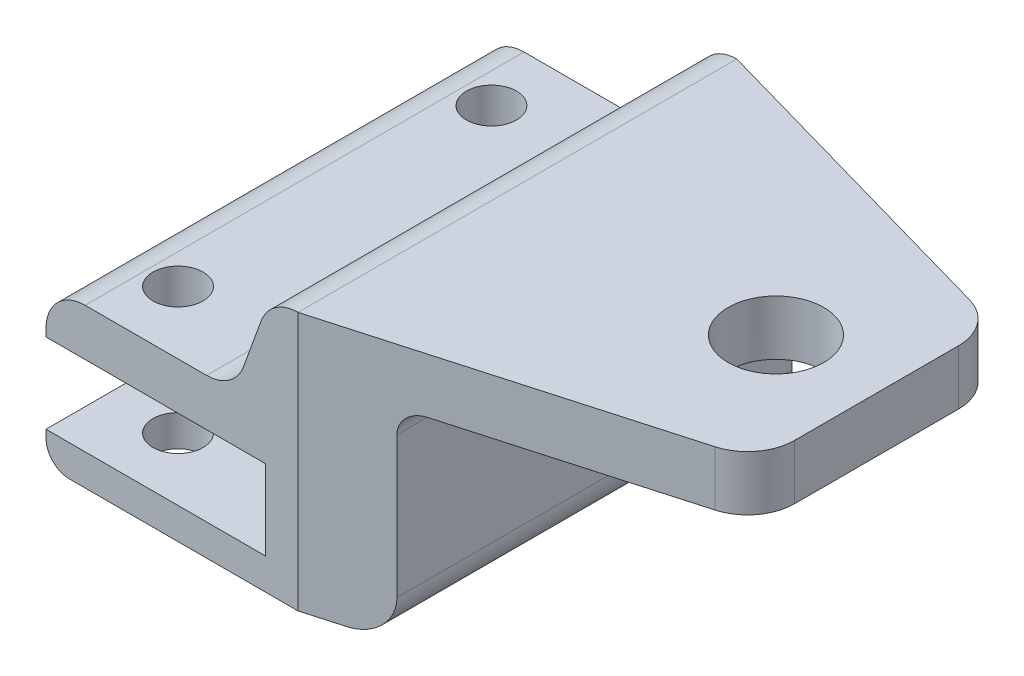
ISO-10303-21;
HEADER;
FILE_DESCRIPTION(('STEP AP214'),'2;1');
FILE_NAME('part.step','',(''),(''),'','','');
FILE_SCHEMA(('AUTOMOTIVE_DESIGN { 1 0 10303 214 1 1 1 1 }'));
ENDSEC;
DATA;
#1=APPLICATION_CONTEXT('core data for automotive mechanical design processes');
#2=APPLICATION_PROTOCOL_DEFINITION('international standard','automotive_design',2000,#1);
#3=PRODUCT_CONTEXT('',#1,'mechanical');
#4=PRODUCT('Part','Part','',(#3));
#5=PRODUCT_RELATED_PRODUCT_CATEGORY('part','',(#4));
#6=PRODUCT_DEFINITION_FORMATION('','',#4);
#7=PRODUCT_DEFINITION_CONTEXT('part definition',#1,'design');
#8=PRODUCT_DEFINITION('design','',#6,#7);
#9=PRODUCT_DEFINITION_SHAPE('','',#8);
#10=(LENGTH_UNIT() NAMED_UNIT(*) SI_UNIT(.MILLI.,.METRE.));
#11=(NAMED_UNIT(*) PLANE_ANGLE_UNIT() SI_UNIT($,.RADIAN.));
#12=(NAMED_UNIT(*) SI_UNIT($,.STERADIAN.) SOLID_ANGLE_UNIT());
#13=UNCERTAINTY_MEASURE_WITH_UNIT(LENGTH_MEASURE(1.E-05),#10,'distance_accuracy_value','');
#14=(GEOMETRIC_REPRESENTATION_CONTEXT(3) GLOBAL_UNCERTAINTY_ASSIGNED_CONTEXT((#13)) GLOBAL_UNIT_ASSIGNED_CONTEXT((#10,
#11,#12)) REPRESENTATION_CONTEXT('',''));
#15=CARTESIAN_POINT('',(0.,0.,0.));
#16=DIRECTION('',(0.,0.,1.));
#17=DIRECTION('',(1.,0.,0.));
#18=AXIS2_PLACEMENT_3D('',#15,#16,#17);
#19=CARTESIAN_POINT('',(18.5,2.5,28.));
#20=DIRECTION('',(0.,0.,-1.));
#21=DIRECTION('',(-1.,0.,0.));
#22=AXIS2_PLACEMENT_3D('',#19,#20,#21);
#23=CYLINDRICAL_SURFACE('',#22,2.5);
#24=DIRECTION('',(0.,0.,-1.));
#25=VECTOR('',#24,1.);
#26=CARTESIAN_POINT('',(21.,2.5,28.));
#27=LINE('',#26,#25);
#28=CARTESIAN_POINT('',(21.,2.5,26.6046960829897));
#29=VERTEX_POINT('',#28);
#30=CARTESIAN_POINT('',(21.,2.5,1.3953039170103));
#31=VERTEX_POINT('',#30);
#32=EDGE_CURVE('E11',#29,#31,#27,.T.);
#33=ORIENTED_EDGE('',*,*,#32,.F.);
#34=CARTESIAN_POINT('',(18.5,2.5,27.3136816500716));
#35=DIRECTION('',(-0.272834907920826,0.,-0.962060867627321));
#36=DIRECTION('',(0.962060867627321,0.,-0.272834907920826));
#37=AXIS2_PLACEMENT_3D('',#34,#35,#36);
#38=ELLIPSE('',#37,2.59858818098029,2.5);
#39=CARTESIAN_POINT('',(18.5,0.,27.3136816500716));
#40=VERTEX_POINT('',#39);
#41=EDGE_CURVE('E290',#29,#40,#38,.T.);
#42=ORIENTED_EDGE('',*,*,#41,.T.);
#43=DIRECTION('',(0.,0.,-1.));
#44=VECTOR('',#43,1.);
#45=CARTESIAN_POINT('',(18.5,0.,28.));
#46=LINE('',#45,#44);
#47=CARTESIAN_POINT('',(18.5,0.,0.686318349928398));
#48=VERTEX_POINT('',#47);
#49=EDGE_CURVE('E162',#40,#48,#46,.T.);
#50=ORIENTED_EDGE('',*,*,#49,.T.);
#51=CARTESIAN_POINT('',(18.5,2.5,0.6863183499284));
#52=DIRECTION('',(-0.272834907920826,0.,0.962060867627321));
#53=DIRECTION('',(-0.962060867627321,0.,-0.272834907920826));
#54=AXIS2_PLACEMENT_3D('',#51,#52,#53);
#55=ELLIPSE('',#54,2.59858818098029,2.5);
#56=EDGE_CURVE('E385',#48,#31,#55,.T.);
#57=ORIENTED_EDGE('',*,*,#56,.T.);
#58=EDGE_LOOP('',(#33,#42,#50,#57));
#59=FACE_BOUND('',#58,.T.);
#60=ADVANCED_FACE('F35',(#59),#23,.T.);
#61=CARTESIAN_POINT('',(21.,11.5,28.));
#62=DIRECTION('',(-1.,0.,0.));
#63=DIRECTION('',(0.,0.,1.));
#64=AXIS2_PLACEMENT_3D('',#61,#62,#63);
#65=PLANE('',#64);
#66=DIRECTION('',(0.,0.,-1.));
#67=VECTOR('',#66,1.);
#68=CARTESIAN_POINT('',(21.,11.5,28.));
#69=LINE('',#68,#67);
#70=CARTESIAN_POINT('',(21.,11.5,26.6046960829897));
#71=VERTEX_POINT('',#70);
#72=CARTESIAN_POINT('',(21.,11.5,1.3953039170103));
#73=VERTEX_POINT('',#72);
#74=EDGE_CURVE('E42',#71,#73,#69,.T.);
#75=ORIENTED_EDGE('',*,*,#74,.F.);
#76=DIRECTION('',(0.,-1.,0.));
#77=VECTOR('',#76,1.);
#78=CARTESIAN_POINT('',(21.,11.5,26.6046960829897));
#79=LINE('',#78,#77);
#80=EDGE_CURVE('E241',#71,#29,#79,.T.);
#81=ORIENTED_EDGE('',*,*,#80,.T.);
#82=ORIENTED_EDGE('',*,*,#32,.T.);
#83=DIRECTION('',(0.,1.,0.));
#84=VECTOR('',#83,1.);
#85=CARTESIAN_POINT('',(21.,11.5,1.3953039170103));
#86=LINE('',#85,#84);
#87=EDGE_CURVE('E244',#31,#73,#86,.T.);
#88=ORIENTED_EDGE('',*,*,#87,.T.);
#89=EDGE_LOOP('',(#75,#81,#82,#88));
#90=FACE_BOUND('',#89,.T.);
#91=ADVANCED_FACE('F238',(#90),#65,.F.);
#92=CARTESIAN_POINT('',(22.5,11.5,28.));
#93=DIRECTION('',(0.,0.,-1.));
#94=DIRECTION('',(-1.,0.,0.));
#95=AXIS2_PLACEMENT_3D('',#92,#93,#94);
#96=CYLINDRICAL_SURFACE('',#95,1.5);
#97=DIRECTION('',(0.,0.,-1.));
#98=VECTOR('',#97,1.);
#99=CARTESIAN_POINT('',(22.5,13.,28.));
#100=LINE('',#99,#98);
#101=CARTESIAN_POINT('',(22.5,13.,26.1793047427406));
#102=VERTEX_POINT('',#101);
#103=CARTESIAN_POINT('',(22.5,13.,1.82069525725944));
#104=VERTEX_POINT('',#103);
#105=EDGE_CURVE('E217',#102,#104,#100,.T.);
#106=ORIENTED_EDGE('',*,*,#105,.F.);
#107=CARTESIAN_POINT('',(22.5,11.5,26.1793047427406));
#108=DIRECTION('',(-0.272834907920826,0.,-0.962060867627321));
#109=DIRECTION('',(0.962060867627321,0.,-0.272834907920826));
#110=AXIS2_PLACEMENT_3D('',#107,#108,#109);
#111=ELLIPSE('',#110,1.55915290858817,1.5);
#112=EDGE_CURVE('E232',#102,#71,#111,.F.);
#113=ORIENTED_EDGE('',*,*,#112,.T.);
#114=ORIENTED_EDGE('',*,*,#74,.T.);
#115=CARTESIAN_POINT('',(22.5,11.5,1.82069525725944));
#116=DIRECTION('',(-0.272834907920826,0.,0.962060867627321));
#117=DIRECTION('',(-0.962060867627321,0.,-0.272834907920826));
#118=AXIS2_PLACEMENT_3D('',#115,#116,#117);
#119=ELLIPSE('',#118,1.55915290858817,1.5);
#120=EDGE_CURVE('E229',#73,#104,#119,.F.);
#121=ORIENTED_EDGE('',*,*,#120,.T.);
#122=EDGE_LOOP('',(#106,#113,#114,#121));
#123=FACE_BOUND('',#122,.T.);
#124=ADVANCED_FACE('F226',(#123),#96,.F.);
#125=CARTESIAN_POINT('',(43.,13.,28.));
#126=DIRECTION('',(0.,1.,0.));
#127=DIRECTION('',(-1.,0.,0.));
#128=AXIS2_PLACEMENT_3D('',#125,#126,#127);
#129=PLANE('',#128);
#130=CARTESIAN_POINT('',(32.579928344828,13.,14.));
#131=DIRECTION('',(0.,1.,0.));
#132=DIRECTION('',(-1.,0.,0.));
#133=AXIS2_PLACEMENT_3D('',#130,#131,#132);
#134=CIRCLE('',#133,3.05000000000001);
#135=CARTESIAN_POINT('',(29.5299283448279,13.,14.));
#136=VERTEX_POINT('',#135);
#137=EDGE_CURVE('E296',#136,#136,#134,.T.);
#138=ORIENTED_EDGE('',*,*,#137,.T.);
#139=EDGE_LOOP('',(#138));
#140=FACE_BOUND('',#139,.T.);
#141=CARTESIAN_POINT('',(36.,13.,19.2324768633219));
#142=DIRECTION('',(0.,1.,0.));
#143=DIRECTION('',(-1.,0.,0.));
#144=AXIS2_PLACEMENT_3D('',#141,#142,#143);
#145=CIRCLE('',#144,3.);
#146=CARTESIAN_POINT('',(39.,13.,19.2324768633219));
#147=VERTEX_POINT('',#146);
#148=CARTESIAN_POINT('',(36.8185047237625,13.,22.1186594662039));
#149=VERTEX_POINT('',#148);
#150=EDGE_CURVE('E266',#147,#149,#145,.F.);
#151=ORIENTED_EDGE('',*,*,#150,.T.);
#152=DIRECTION('',(-0.962060867627321,0.,0.272834907920826));
#153=VECTOR('',#152,1.);
#154=CARTESIAN_POINT('',(40.9960998285627,13.,20.9339176124378));
#155=LINE('',#154,#153);
#156=EDGE_CURVE('E383',#149,#102,#155,.T.);
#157=ORIENTED_EDGE('',*,*,#156,.T.);
#158=ORIENTED_EDGE('',*,*,#105,.T.);
#159=DIRECTION('',(0.962060867627321,0.,0.272834907920826));
#160=VECTOR('',#159,1.);
#161=CARTESIAN_POINT('',(48.3456458990959,13.,9.15037122300688));
#162=LINE('',#161,#160);
#163=CARTESIAN_POINT('',(36.8185047237625,13.,5.8813405337961));
#164=VERTEX_POINT('',#163);
#165=EDGE_CURVE('E410',#104,#164,#162,.T.);
#166=ORIENTED_EDGE('',*,*,#165,.T.);
#167=CARTESIAN_POINT('',(36.,13.,8.76752313667806));
#168=DIRECTION('',(0.,1.,0.));
#169=DIRECTION('',(-1.,0.,0.));
#170=AXIS2_PLACEMENT_3D('',#167,#168,#169);
#171=CIRCLE('',#170,3.);
#172=CARTESIAN_POINT('',(39.,13.,8.76752313667806));
#173=VERTEX_POINT('',#172);
#174=EDGE_CURVE('E288',#164,#173,#171,.F.);
#175=ORIENTED_EDGE('',*,*,#174,.T.);
#176=DIRECTION('',(0.,0.,1.));
#177=VECTOR('',#176,1.);
#178=CARTESIAN_POINT('',(39.,13.,28.));
#179=LINE('',#178,#177);
#180=EDGE_CURVE('E259',#173,#147,#179,.T.);
#181=ORIENTED_EDGE('',*,*,#180,.T.);
#182=EDGE_LOOP('',(#151,#157,#158,#166,#175,#181));
#183=FACE_BOUND('',#182,.T.);
#184=ADVANCED_FACE('F285',(#140,#183),#129,.F.);
#185=CARTESIAN_POINT('',(16.079928344828,16.5,28.));
#186=DIRECTION('',(0.,-1.,0.));
#187=DIRECTION('',(1.,0.,0.));
#188=AXIS2_PLACEMENT_3D('',#185,#186,#187);
#189=PLANE('',#188);
#190=CARTESIAN_POINT('',(32.579928344828,16.5,14.));
#191=DIRECTION('',(0.,1.,0.));
#192=DIRECTION('',(0.,0.,1.));
#193=AXIS2_PLACEMENT_3D('',#190,#191,#192);
#194=CIRCLE('',#193,3.05000000000001);
#195=CARTESIAN_POINT('',(32.579928344828,16.5,17.05));
#196=VERTEX_POINT('',#195);
#197=EDGE_CURVE('E276',#196,#196,#194,.T.);
#198=ORIENTED_EDGE('',*,*,#197,.F.);
#199=EDGE_LOOP('',(#198));
#200=FACE_BOUND('',#199,.T.);
#201=DIRECTION('',(0.,0.,-1.));
#202=VECTOR('',#201,1.);
#203=CARTESIAN_POINT('',(16.079928344828,16.5,28.));
#204=LINE('',#203,#202);
#205=CARTESIAN_POINT('',(16.079928344828,16.5,28.));
#206=VERTEX_POINT('',#205);
#207=CARTESIAN_POINT('',(16.079928344828,16.5,0.));
#208=VERTEX_POINT('',#207);
#209=EDGE_CURVE('E214',#206,#208,#204,.T.);
#210=ORIENTED_EDGE('',*,*,#209,.F.);
#211=DIRECTION('',(-0.962060867627321,0.,0.272834907920826));
#212=VECTOR('',#211,1.);
#213=CARTESIAN_POINT('',(36.8185047237625,16.5,22.1186594662039));
#214=LINE('',#213,#212);
#215=CARTESIAN_POINT('',(36.8185047237625,16.5,22.1186594662039));
#216=VERTEX_POINT('',#215);
#217=EDGE_CURVE('E400',#216,#206,#214,.T.);
#218=ORIENTED_EDGE('',*,*,#217,.F.);
#219=CARTESIAN_POINT('',(36.,16.5,19.2324768633219));
#220=DIRECTION('',(0.,-1.,0.));
#221=DIRECTION('',(0.,0.,-1.));
#222=AXIS2_PLACEMENT_3D('',#219,#220,#221);
#223=CIRCLE('',#222,3.);
#224=CARTESIAN_POINT('',(39.,16.5,19.2324768633219));
#225=VERTEX_POINT('',#224);
#226=EDGE_CURVE('E397',#225,#216,#223,.T.);
#227=ORIENTED_EDGE('',*,*,#226,.F.);
#228=DIRECTION('',(0.,0.,1.));
#229=VECTOR('',#228,1.);
#230=CARTESIAN_POINT('',(39.,16.5,8.76752313667806));
#231=LINE('',#230,#229);
#232=CARTESIAN_POINT('',(39.,16.5,8.76752313667806));
#233=VERTEX_POINT('',#232);
#234=EDGE_CURVE('E280',#233,#225,#231,.T.);
#235=ORIENTED_EDGE('',*,*,#234,.F.);
#236=CARTESIAN_POINT('',(36.,16.5,8.76752313667806));
#237=DIRECTION('',(0.,-1.,0.));
#238=DIRECTION('',(0.,0.,-1.));
#239=AXIS2_PLACEMENT_3D('',#236,#237,#238);
#240=CIRCLE('',#239,3.);
#241=CARTESIAN_POINT('',(36.8185047237625,16.5,5.8813405337961));
#242=VERTEX_POINT('',#241);
#243=EDGE_CURVE('E405',#242,#233,#240,.T.);
#244=ORIENTED_EDGE('',*,*,#243,.F.);
#245=DIRECTION('',(0.962060867627321,0.,0.272834907920826));
#246=VECTOR('',#245,1.);
#247=CARTESIAN_POINT('',(16.079928344828,16.5,0.));
#248=LINE('',#247,#246);
#249=EDGE_CURVE('E402',#208,#242,#248,.T.);
#250=ORIENTED_EDGE('',*,*,#249,.F.);
#251=EDGE_LOOP('',(#210,#218,#227,#235,#244,#250));
#252=FACE_BOUND('',#251,.T.);
#253=ADVANCED_FACE('F424',(#200,#252),#189,.F.);
#254=CARTESIAN_POINT('',(16.079928344828,14.,28.));
#255=DIRECTION('',(0.,0.,-1.));
#256=DIRECTION('',(-1.,0.,0.));
#257=AXIS2_PLACEMENT_3D('',#254,#255,#256);
#258=CYLINDRICAL_SURFACE('',#257,2.5);
#259=CARTESIAN_POINT('',(16.079928344828,14.,0.));
#260=DIRECTION('',(0.,0.,1.));
#261=DIRECTION('',(-1.,0.,0.));
#262=AXIS2_PLACEMENT_3D('',#259,#260,#261);
#263=CIRCLE('',#262,2.5);
#264=CARTESIAN_POINT('',(13.7306967928632,14.8550503583142,0.));
#265=VERTEX_POINT('',#264);
#266=EDGE_CURVE('E163',#208,#265,#263,.T.);
#267=ORIENTED_EDGE('',*,*,#266,.T.);
#268=DIRECTION('',(0.,0.,-1.));
#269=VECTOR('',#268,1.);
#270=CARTESIAN_POINT('',(13.7306967928632,14.8550503583142,28.));
#271=LINE('',#270,#269);
#272=CARTESIAN_POINT('',(13.7306967928632,14.8550503583142,28.));
#273=VERTEX_POINT('',#272);
#274=EDGE_CURVE('E211',#273,#265,#271,.T.);
#275=ORIENTED_EDGE('',*,*,#274,.F.);
#276=CARTESIAN_POINT('',(16.079928344828,14.,28.));
#277=DIRECTION('',(0.,0.,1.));
#278=DIRECTION('',(-1.,0.,0.));
#279=AXIS2_PLACEMENT_3D('',#276,#277,#278);
#280=CIRCLE('',#279,2.5);
#281=EDGE_CURVE('E108',#206,#273,#280,.T.);
#282=ORIENTED_EDGE('',*,*,#281,.F.);
#283=ORIENTED_EDGE('',*,*,#209,.T.);
#284=EDGE_LOOP('',(#267,#275,#282,#283));
#285=FACE_BOUND('',#284,.T.);
#286=ADVANCED_FACE('F428',(#285),#258,.T.);
#287=CARTESIAN_POINT('',(13.7306967928632,14.8550503583142,28.));
#288=DIRECTION('',(0.939692620785909,-0.342020143325667,0.));
#289=DIRECTION('',(0.342020143325667,0.939692620785909,0.));
#290=AXIS2_PLACEMENT_3D('',#287,#288,#289);
#291=PLANE('',#290);
#292=DIRECTION('',(-0.342020143325667,-0.939692620785909,0.));
#293=VECTOR('',#292,1.);
#294=CARTESIAN_POINT('',(13.7306967928632,14.8550503583142,0.));
#295=LINE('',#294,#293);
#296=CARTESIAN_POINT('',(12.5987127064405,11.7449496416858,0.));
#297=VERTEX_POINT('',#296);
#298=EDGE_CURVE('E165',#265,#297,#295,.T.);
#299=ORIENTED_EDGE('',*,*,#298,.T.);
#300=DIRECTION('',(0.,0.,-1.));
#301=VECTOR('',#300,1.);
#302=CARTESIAN_POINT('',(12.5987127064405,11.7449496416858,28.));
#303=LINE('',#302,#301);
#304=CARTESIAN_POINT('',(12.5987127064405,11.7449496416858,28.));
#305=VERTEX_POINT('',#304);
#306=EDGE_CURVE('E208',#305,#297,#303,.T.);
#307=ORIENTED_EDGE('',*,*,#306,.F.);
#308=DIRECTION('',(-0.342020143325667,-0.939692620785909,0.));
#309=VECTOR('',#308,1.);
#310=CARTESIAN_POINT('',(13.7306967928632,14.8550503583142,28.));
#311=LINE('',#310,#309);
#312=EDGE_CURVE('E323',#273,#305,#311,.T.);
#313=ORIENTED_EDGE('',*,*,#312,.F.);
#314=ORIENTED_EDGE('',*,*,#274,.T.);
#315=EDGE_LOOP('',(#299,#307,#313,#314));
#316=FACE_BOUND('',#315,.T.);
#317=ADVANCED_FACE('F433',(#316),#291,.F.);
#318=CARTESIAN_POINT('',(10.2494811544757,12.6,28.));
#319=DIRECTION('',(0.,0.,-1.));
#320=DIRECTION('',(-1.,0.,0.));
#321=AXIS2_PLACEMENT_3D('',#318,#319,#320);
#322=CYLINDRICAL_SURFACE('',#321,2.5);
#323=CARTESIAN_POINT('',(10.2494811544757,12.6,0.));
#324=DIRECTION('',(0.,0.,-1.));
#325=DIRECTION('',(-1.,0.,0.));
#326=AXIS2_PLACEMENT_3D('',#323,#324,#325);
#327=CIRCLE('',#326,2.5);
#328=CARTESIAN_POINT('',(10.2494811544757,10.1,0.));
#329=VERTEX_POINT('',#328);
#330=EDGE_CURVE('E168',#297,#329,#327,.T.);
#331=ORIENTED_EDGE('',*,*,#330,.T.);
#332=DIRECTION('',(0.,0.,-1.));
#333=VECTOR('',#332,1.);
#334=CARTESIAN_POINT('',(10.2494811544757,10.1,28.));
#335=LINE('',#334,#333);
#336=CARTESIAN_POINT('',(10.2494811544757,10.1,28.));
#337=VERTEX_POINT('',#336);
#338=EDGE_CURVE('E205',#337,#329,#335,.T.);
#339=ORIENTED_EDGE('',*,*,#338,.F.);
#340=CARTESIAN_POINT('',(10.2494811544757,12.6,28.));
#341=DIRECTION('',(0.,0.,-1.));
#342=DIRECTION('',(-1.,0.,0.));
#343=AXIS2_PLACEMENT_3D('',#340,#341,#342);
#344=CIRCLE('',#343,2.5);
#345=EDGE_CURVE('E325',#305,#337,#344,.T.);
#346=ORIENTED_EDGE('',*,*,#345,.F.);
#347=ORIENTED_EDGE('',*,*,#306,.T.);
#348=EDGE_LOOP('',(#331,#339,#346,#347));
#349=FACE_BOUND('',#348,.T.);
#350=ADVANCED_FACE('F439',(#349),#322,.F.);
#351=CARTESIAN_POINT('',(10.2494811544757,10.1,28.));
#352=DIRECTION('',(0.,-1.,0.));
#353=DIRECTION('',(0.,0.,-1.));
#354=AXIS2_PLACEMENT_3D('',#351,#352,#353);
#355=PLANE('',#354);
#356=CARTESIAN_POINT('',(4.42409693045811,10.1,24.));
#357=DIRECTION('',(0.,1.,0.));
#358=DIRECTION('',(-1.,0.,0.));
#359=AXIS2_PLACEMENT_3D('',#356,#357,#358);
#360=CIRCLE('',#359,1.6);
#361=CARTESIAN_POINT('',(2.82409693045811,10.1,24.));
#362=VERTEX_POINT('',#361);
#363=EDGE_CURVE('E299',#362,#362,#360,.T.);
#364=ORIENTED_EDGE('',*,*,#363,.F.);
#365=EDGE_LOOP('',(#364));
#366=FACE_BOUND('',#365,.T.);
#367=CARTESIAN_POINT('',(4.42409693045811,10.1,4.));
#368=DIRECTION('',(0.,1.,0.));
#369=DIRECTION('',(-1.,0.,0.));
#370=AXIS2_PLACEMENT_3D('',#367,#368,#369);
#371=CIRCLE('',#370,1.6);
#372=CARTESIAN_POINT('',(2.82409693045811,10.1,4.));
#373=VERTEX_POINT('',#372);
#374=EDGE_CURVE('E311',#373,#373,#371,.T.);
#375=ORIENTED_EDGE('',*,*,#374,.F.);
#376=EDGE_LOOP('',(#375));
#377=FACE_BOUND('',#376,.T.);
#378=DIRECTION('',(-1.,0.,0.));
#379=VECTOR('',#378,1.);
#380=CARTESIAN_POINT('',(10.2494811544757,10.1,0.));
#381=LINE('',#380,#379);
#382=CARTESIAN_POINT('',(2.5,10.1,0.));
#383=VERTEX_POINT('',#382);
#384=EDGE_CURVE('E170',#329,#383,#381,.T.);
#385=ORIENTED_EDGE('',*,*,#384,.T.);
#386=DIRECTION('',(0.,0.,-1.));
#387=VECTOR('',#386,1.);
#388=CARTESIAN_POINT('',(2.5,10.1,28.));
#389=LINE('',#388,#387);
#390=CARTESIAN_POINT('',(2.5,10.1,28.));
#391=VERTEX_POINT('',#390);
#392=EDGE_CURVE('E202',#391,#383,#389,.T.);
#393=ORIENTED_EDGE('',*,*,#392,.F.);
#394=DIRECTION('',(-1.,0.,0.));
#395=VECTOR('',#394,1.);
#396=CARTESIAN_POINT('',(10.2494811544757,10.1,28.));
#397=LINE('',#396,#395);
#398=EDGE_CURVE('E327',#337,#391,#397,.T.);
#399=ORIENTED_EDGE('',*,*,#398,.F.);
#400=ORIENTED_EDGE('',*,*,#338,.T.);
#401=EDGE_LOOP('',(#385,#393,#399,#400));
#402=FACE_BOUND('',#401,.T.);
#403=ADVANCED_FACE('F443',(#366,#377,#402),#355,.F.);
#404=CARTESIAN_POINT('',(2.5,7.6,28.));
#405=DIRECTION('',(0.,0.,-1.));
#406=DIRECTION('',(-1.,0.,0.));
#407=AXIS2_PLACEMENT_3D('',#404,#405,#406);
#408=CYLINDRICAL_SURFACE('',#407,2.5);
#409=CARTESIAN_POINT('',(2.5,7.6,0.));
#410=DIRECTION('',(0.,0.,1.));
#411=DIRECTION('',(1.,0.,0.));
#412=AXIS2_PLACEMENT_3D('',#409,#410,#411);
#413=CIRCLE('',#412,2.5);
#414=CARTESIAN_POINT('',(0.,7.6,0.));
#415=VERTEX_POINT('',#414);
#416=EDGE_CURVE('E172',#383,#415,#413,.T.);
#417=ORIENTED_EDGE('',*,*,#416,.T.);
#418=DIRECTION('',(0.,0.,-1.));
#419=VECTOR('',#418,1.);
#420=CARTESIAN_POINT('',(0.,7.6,28.));
#421=LINE('',#420,#419);
#422=CARTESIAN_POINT('',(0.,7.6,28.));
#423=VERTEX_POINT('',#422);
#424=EDGE_CURVE('E199',#423,#415,#421,.T.);
#425=ORIENTED_EDGE('',*,*,#424,.F.);
#426=CARTESIAN_POINT('',(2.5,7.6,28.));
#427=DIRECTION('',(0.,0.,1.));
#428=DIRECTION('',(1.,0.,0.));
#429=AXIS2_PLACEMENT_3D('',#426,#427,#428);
#430=CIRCLE('',#429,2.5);
#431=EDGE_CURVE('E329',#391,#423,#430,.T.);
#432=ORIENTED_EDGE('',*,*,#431,.F.);
#433=ORIENTED_EDGE('',*,*,#392,.T.);
#434=EDGE_LOOP('',(#417,#425,#432,#433));
#435=FACE_BOUND('',#434,.T.);
#436=ADVANCED_FACE('F448',(#435),#408,.T.);
#437=CARTESIAN_POINT('',(0.,7.6,28.));
#438=DIRECTION('',(1.,0.,0.));
#439=DIRECTION('',(0.,1.,0.));
#440=AXIS2_PLACEMENT_3D('',#437,#438,#439);
#441=PLANE('',#440);
#442=DIRECTION('',(0.,-1.,0.));
#443=VECTOR('',#442,1.);
#444=CARTESIAN_POINT('',(0.,7.6,0.));
#445=LINE('',#444,#443);
#446=CARTESIAN_POINT('',(0.,7.1,0.));
#447=VERTEX_POINT('',#446);
#448=EDGE_CURVE('E174',#415,#447,#445,.T.);
#449=ORIENTED_EDGE('',*,*,#448,.T.);
#450=DIRECTION('',(0.,0.,-1.));
#451=VECTOR('',#450,1.);
#452=CARTESIAN_POINT('',(0.,7.1,28.));
#453=LINE('',#452,#451);
#454=CARTESIAN_POINT('',(0.,7.1,28.));
#455=VERTEX_POINT('',#454);
#456=EDGE_CURVE('E196',#455,#447,#453,.T.);
#457=ORIENTED_EDGE('',*,*,#456,.F.);
#458=DIRECTION('',(0.,-1.,0.));
#459=VECTOR('',#458,1.);
#460=CARTESIAN_POINT('',(0.,7.6,28.));
#461=LINE('',#460,#459);
#462=EDGE_CURVE('E331',#423,#455,#461,.T.);
#463=ORIENTED_EDGE('',*,*,#462,.F.);
#464=ORIENTED_EDGE('',*,*,#424,.T.);
#465=EDGE_LOOP('',(#449,#457,#463,#464));
#466=FACE_BOUND('',#465,.T.);
#467=ADVANCED_FACE('F451',(#466),#441,.F.);
#468=CARTESIAN_POINT('',(0.,7.1,28.));
#469=DIRECTION('',(0.,1.,0.));
#470=DIRECTION('',(-1.,0.,0.));
#471=AXIS2_PLACEMENT_3D('',#468,#469,#470);
#472=PLANE('',#471);
#473=CARTESIAN_POINT('',(4.42409693045811,7.1,24.));
#474=DIRECTION('',(0.,1.,0.));
#475=DIRECTION('',(-1.,0.,0.));
#476=AXIS2_PLACEMENT_3D('',#473,#474,#475);
#477=CIRCLE('',#476,1.6);
#478=CARTESIAN_POINT('',(2.82409693045811,7.1,24.));
#479=VERTEX_POINT('',#478);
#480=EDGE_CURVE('E308',#479,#479,#477,.T.);
#481=ORIENTED_EDGE('',*,*,#480,.T.);
#482=EDGE_LOOP('',(#481));
#483=FACE_BOUND('',#482,.T.);
#484=CARTESIAN_POINT('',(4.42409693045811,7.1,4.));
#485=DIRECTION('',(0.,1.,0.));
#486=DIRECTION('',(-1.,0.,0.));
#487=AXIS2_PLACEMENT_3D('',#484,#485,#486);
#488=CIRCLE('',#487,1.6);
#489=CARTESIAN_POINT('',(2.82409693045811,7.1,4.));
#490=VERTEX_POINT('',#489);
#491=EDGE_CURVE('E166',#490,#490,#488,.T.);
#492=ORIENTED_EDGE('',*,*,#491,.T.);
#493=EDGE_LOOP('',(#492));
#494=FACE_BOUND('',#493,.T.);
#495=DIRECTION('',(1.,0.,0.));
#496=VECTOR('',#495,1.);
#497=CARTESIAN_POINT('',(0.,7.1,0.));
#498=LINE('',#497,#496);
#499=CARTESIAN_POINT('',(14.,7.1,0.));
#500=VERTEX_POINT('',#499);
#501=EDGE_CURVE('E176',#447,#500,#498,.T.);
#502=ORIENTED_EDGE('',*,*,#501,.T.);
#503=DIRECTION('',(0.,0.,-1.));
#504=VECTOR('',#503,1.);
#505=CARTESIAN_POINT('',(14.,7.1,28.));
#506=LINE('',#505,#504);
#507=CARTESIAN_POINT('',(14.,7.1,28.));
#508=VERTEX_POINT('',#507);
#509=EDGE_CURVE('E193',#508,#500,#506,.T.);
#510=ORIENTED_EDGE('',*,*,#509,.F.);
#511=DIRECTION('',(1.,0.,0.));
#512=VECTOR('',#511,1.);
#513=CARTESIAN_POINT('',(0.,7.1,28.));
#514=LINE('',#513,#512);
#515=EDGE_CURVE('E333',#455,#508,#514,.T.);
#516=ORIENTED_EDGE('',*,*,#515,.F.);
#517=ORIENTED_EDGE('',*,*,#456,.T.);
#518=EDGE_LOOP('',(#502,#510,#516,#517));
#519=FACE_BOUND('',#518,.T.);
#520=ADVANCED_FACE('F339',(#483,#494,#519),#472,.F.);
#521=CARTESIAN_POINT('',(14.,7.1,28.));
#522=DIRECTION('',(1.,0.,0.));
#523=DIRECTION('',(0.,0.,-1.));
#524=AXIS2_PLACEMENT_3D('',#521,#522,#523);
#525=PLANE('',#524);
#526=DIRECTION('',(0.,-1.,0.));
#527=VECTOR('',#526,1.);
#528=CARTESIAN_POINT('',(14.,7.1,0.));
#529=LINE('',#528,#527);
#530=CARTESIAN_POINT('',(14.,2.,0.));
#531=VERTEX_POINT('',#530);
#532=EDGE_CURVE('E178',#500,#531,#529,.T.);
#533=ORIENTED_EDGE('',*,*,#532,.T.);
#534=DIRECTION('',(0.,0.,-1.));
#535=VECTOR('',#534,1.);
#536=CARTESIAN_POINT('',(14.,2.,28.));
#537=LINE('',#536,#535);
#538=CARTESIAN_POINT('',(14.,2.,28.));
#539=VERTEX_POINT('',#538);
#540=EDGE_CURVE('E152',#539,#531,#537,.T.);
#541=ORIENTED_EDGE('',*,*,#540,.F.);
#542=DIRECTION('',(0.,-1.,0.));
#543=VECTOR('',#542,1.);
#544=CARTESIAN_POINT('',(14.,7.1,28.));
#545=LINE('',#544,#543);
#546=EDGE_CURVE('E140',#508,#539,#545,.T.);
#547=ORIENTED_EDGE('',*,*,#546,.F.);
#548=ORIENTED_EDGE('',*,*,#509,.T.);
#549=EDGE_LOOP('',(#533,#541,#547,#548));
#550=FACE_BOUND('',#549,.T.);
#551=ADVANCED_FACE('F343',(#550),#525,.F.);
#552=CARTESIAN_POINT('',(14.,2.,28.));
#553=DIRECTION('',(0.,-1.,0.));
#554=DIRECTION('',(1.,0.,0.));
#555=AXIS2_PLACEMENT_3D('',#552,#553,#554);
#556=PLANE('',#555);
#557=CARTESIAN_POINT('',(4.42409693045812,2.,24.));
#558=DIRECTION('',(0.,-1.,0.));
#559=DIRECTION('',(1.,0.,0.));
#560=AXIS2_PLACEMENT_3D('',#557,#558,#559);
#561=CIRCLE('',#560,1.6);
#562=CARTESIAN_POINT('',(6.02409693045812,2.,24.));
#563=VERTEX_POINT('',#562);
#564=EDGE_CURVE('E303',#563,#563,#561,.T.);
#565=ORIENTED_EDGE('',*,*,#564,.T.);
#566=EDGE_LOOP('',(#565));
#567=FACE_BOUND('',#566,.T.);
#568=CARTESIAN_POINT('',(4.42409693045812,2.,4.));
#569=DIRECTION('',(0.,-1.,0.));
#570=DIRECTION('',(1.,0.,0.));
#571=AXIS2_PLACEMENT_3D('',#568,#569,#570);
#572=CIRCLE('',#571,1.6);
#573=CARTESIAN_POINT('',(6.02409693045812,2.,4.));
#574=VERTEX_POINT('',#573);
#575=EDGE_CURVE('E315',#574,#574,#572,.T.);
#576=ORIENTED_EDGE('',*,*,#575,.T.);
#577=EDGE_LOOP('',(#576));
#578=FACE_BOUND('',#577,.T.);
#579=DIRECTION('',(-1.,0.,0.));
#580=VECTOR('',#579,1.);
#581=CARTESIAN_POINT('',(14.,2.,0.));
#582=LINE('',#581,#580);
#583=CARTESIAN_POINT('',(0.,2.,0.));
#584=VERTEX_POINT('',#583);
#585=EDGE_CURVE('E149',#531,#584,#582,.T.);
#586=ORIENTED_EDGE('',*,*,#585,.T.);
#587=DIRECTION('',(0.,0.,-1.));
#588=VECTOR('',#587,1.);
#589=CARTESIAN_POINT('',(0.,2.,28.));
#590=LINE('',#589,#588);
#591=CARTESIAN_POINT('',(0.,2.,28.));
#592=VERTEX_POINT('',#591);
#593=EDGE_CURVE('E146',#592,#584,#590,.T.);
#594=ORIENTED_EDGE('',*,*,#593,.F.);
#595=DIRECTION('',(-1.,0.,0.));
#596=VECTOR('',#595,1.);
#597=CARTESIAN_POINT('',(14.,2.,28.));
#598=LINE('',#597,#596);
#599=EDGE_CURVE('E133',#539,#592,#598,.T.);
#600=ORIENTED_EDGE('',*,*,#599,.F.);
#601=ORIENTED_EDGE('',*,*,#540,.T.);
#602=EDGE_LOOP('',(#586,#594,#600,#601));
#603=FACE_BOUND('',#602,.T.);
#604=ADVANCED_FACE('F147',(#567,#578,#603),#556,.F.);
#605=CARTESIAN_POINT('',(0.,2.,28.));
#606=DIRECTION('',(1.,0.,0.));
#607=DIRECTION('',(0.,1.,0.));
#608=AXIS2_PLACEMENT_3D('',#605,#606,#607);
#609=PLANE('',#608);
#610=DIRECTION('',(0.,-1.,0.));
#611=VECTOR('',#610,1.);
#612=CARTESIAN_POINT('',(0.,2.,0.));
#613=LINE('',#612,#611);
#614=CARTESIAN_POINT('',(0.,1.50000000000001,0.));
#615=VERTEX_POINT('',#614);
#616=EDGE_CURVE('E181',#584,#615,#613,.T.);
#617=ORIENTED_EDGE('',*,*,#616,.T.);
#618=DIRECTION('',(0.,0.,-1.));
#619=VECTOR('',#618,1.);
#620=CARTESIAN_POINT('',(0.,1.50000000000001,28.));
#621=LINE('',#620,#619);
#622=CARTESIAN_POINT('',(0.,1.50000000000001,28.));
#623=VERTEX_POINT('',#622);
#624=EDGE_CURVE('E153',#623,#615,#621,.T.);
#625=ORIENTED_EDGE('',*,*,#624,.F.);
#626=DIRECTION('',(0.,-1.,0.));
#627=VECTOR('',#626,1.);
#628=CARTESIAN_POINT('',(0.,2.,28.));
#629=LINE('',#628,#627);
#630=EDGE_CURVE('E137',#592,#623,#629,.T.);
#631=ORIENTED_EDGE('',*,*,#630,.F.);
#632=ORIENTED_EDGE('',*,*,#593,.T.);
#633=EDGE_LOOP('',(#617,#625,#631,#632));
#634=FACE_BOUND('',#633,.T.);
#635=ADVANCED_FACE('F155',(#634),#609,.F.);
#636=CARTESIAN_POINT('',(1.5,1.5,28.));
#637=DIRECTION('',(0.,0.,-1.));
#638=DIRECTION('',(-1.,0.,0.));
#639=AXIS2_PLACEMENT_3D('',#636,#637,#638);
#640=CYLINDRICAL_SURFACE('',#639,1.5);
#641=CARTESIAN_POINT('',(1.5,1.5,0.));
#642=DIRECTION('',(0.,0.,1.));
#643=DIRECTION('',(-1.,0.,0.));
#644=AXIS2_PLACEMENT_3D('',#641,#642,#643);
#645=CIRCLE('',#644,1.5);
#646=CARTESIAN_POINT('',(1.50000000000001,0.,0.));
#647=VERTEX_POINT('',#646);
#648=EDGE_CURVE('E100',#615,#647,#645,.T.);
#649=ORIENTED_EDGE('',*,*,#648,.T.);
#650=DIRECTION('',(0.,0.,-1.));
#651=VECTOR('',#650,1.);
#652=CARTESIAN_POINT('',(1.50000000000001,0.,28.));
#653=LINE('',#652,#651);
#654=CARTESIAN_POINT('',(1.50000000000001,0.,28.));
#655=VERTEX_POINT('',#654);
#656=EDGE_CURVE('E189',#655,#647,#653,.T.);
#657=ORIENTED_EDGE('',*,*,#656,.F.);
#658=CARTESIAN_POINT('',(1.5,1.5,28.));
#659=DIRECTION('',(0.,0.,1.));
#660=DIRECTION('',(-1.,0.,0.));
#661=AXIS2_PLACEMENT_3D('',#658,#659,#660);
#662=CIRCLE('',#661,1.5);
#663=EDGE_CURVE('E58',#623,#655,#662,.T.);
#664=ORIENTED_EDGE('',*,*,#663,.F.);
#665=ORIENTED_EDGE('',*,*,#624,.T.);
#666=EDGE_LOOP('',(#649,#657,#664,#665));
#667=FACE_BOUND('',#666,.T.);
#668=ADVANCED_FACE('F347',(#667),#640,.T.);
#669=CARTESIAN_POINT('',(1.50000000000001,0.,28.));
#670=DIRECTION('',(0.,1.,0.));
#671=DIRECTION('',(0.,0.,1.));
#672=AXIS2_PLACEMENT_3D('',#669,#670,#671);
#673=PLANE('',#672);
#674=CARTESIAN_POINT('',(4.42409693045812,0.,24.));
#675=DIRECTION('',(0.,1.,0.));
#676=DIRECTION('',(-1.,0.,0.));
#677=AXIS2_PLACEMENT_3D('',#674,#675,#676);
#678=CIRCLE('',#677,1.6);
#679=CARTESIAN_POINT('',(2.82409693045812,0.,24.));
#680=VERTEX_POINT('',#679);
#681=EDGE_CURVE('E300',#680,#680,#678,.T.);
#682=ORIENTED_EDGE('',*,*,#681,.T.);
#683=EDGE_LOOP('',(#682));
#684=FACE_BOUND('',#683,.T.);
#685=CARTESIAN_POINT('',(4.42409693045812,0.,4.));
#686=DIRECTION('',(0.,1.,0.));
#687=DIRECTION('',(-1.,0.,0.));
#688=AXIS2_PLACEMENT_3D('',#685,#686,#687);
#689=CIRCLE('',#688,1.6);
#690=CARTESIAN_POINT('',(2.82409693045811,0.,4.));
#691=VERTEX_POINT('',#690);
#692=EDGE_CURVE('E312',#691,#691,#689,.T.);
#693=ORIENTED_EDGE('',*,*,#692,.T.);
#694=EDGE_LOOP('',(#693));
#695=FACE_BOUND('',#694,.T.);
#696=ORIENTED_EDGE('',*,*,#49,.F.);
#697=DIRECTION('',(-0.962060867627321,0.,0.272834907920826));
#698=VECTOR('',#697,1.);
#699=CARTESIAN_POINT('',(36.8185047237625,0.,22.1186594662039));
#700=LINE('',#699,#698);
#701=CARTESIAN_POINT('',(16.079928344828,0.,28.));
#702=VERTEX_POINT('',#701);
#703=EDGE_CURVE('E355',#40,#702,#700,.T.);
#704=ORIENTED_EDGE('',*,*,#703,.T.);
#705=DIRECTION('',(1.,0.,0.));
#706=VECTOR('',#705,1.);
#707=CARTESIAN_POINT('',(1.50000000000001,0.,28.));
#708=LINE('',#707,#706);
#709=EDGE_CURVE('E157',#655,#702,#708,.T.);
#710=ORIENTED_EDGE('',*,*,#709,.F.);
#711=ORIENTED_EDGE('',*,*,#656,.T.);
#712=DIRECTION('',(1.,0.,0.));
#713=VECTOR('',#712,1.);
#714=CARTESIAN_POINT('',(1.50000000000001,0.,0.));
#715=LINE('',#714,#713);
#716=CARTESIAN_POINT('',(16.079928344828,0.,0.));
#717=VERTEX_POINT('',#716);
#718=EDGE_CURVE('E184',#647,#717,#715,.T.);
#719=ORIENTED_EDGE('',*,*,#718,.T.);
#720=DIRECTION('',(0.962060867627321,0.,0.272834907920826));
#721=VECTOR('',#720,1.);
#722=CARTESIAN_POINT('',(16.079928344828,0.,0.));
#723=LINE('',#722,#721);
#724=EDGE_CURVE('E49',#717,#48,#723,.T.);
#725=ORIENTED_EDGE('',*,*,#724,.T.);
#726=EDGE_LOOP('',(#696,#704,#710,#711,#719,#725));
#727=FACE_BOUND('',#726,.T.);
#728=ADVANCED_FACE('F352',(#684,#695,#727),#673,.F.);
#729=CARTESIAN_POINT('',(18.5,2.5,28.));
#730=DIRECTION('',(0.,0.,-1.));
#731=DIRECTION('',(-1.,0.,0.));
#732=AXIS2_PLACEMENT_3D('',#729,#730,#731);
#733=PLANE('',#732);
#734=ORIENTED_EDGE('',*,*,#709,.T.);
#735=DIRECTION('',(0.,1.,0.));
#736=VECTOR('',#735,1.);
#737=CARTESIAN_POINT('',(16.079928344828,0.,28.));
#738=LINE('',#737,#736);
#739=EDGE_CURVE('E358',#702,#206,#738,.T.);
#740=ORIENTED_EDGE('',*,*,#739,.T.);
#741=ORIENTED_EDGE('',*,*,#281,.T.);
#742=ORIENTED_EDGE('',*,*,#312,.T.);
#743=ORIENTED_EDGE('',*,*,#345,.T.);
#744=ORIENTED_EDGE('',*,*,#398,.T.);
#745=ORIENTED_EDGE('',*,*,#431,.T.);
#746=ORIENTED_EDGE('',*,*,#462,.T.);
#747=ORIENTED_EDGE('',*,*,#515,.T.);
#748=ORIENTED_EDGE('',*,*,#546,.T.);
#749=ORIENTED_EDGE('',*,*,#599,.T.);
#750=ORIENTED_EDGE('',*,*,#630,.T.);
#751=ORIENTED_EDGE('',*,*,#663,.T.);
#752=EDGE_LOOP('',(#734,#740,#741,#742,#743,#744,#745,#746,#747,#748,#749,#750,#751));
#753=FACE_BOUND('',#752,.T.);
#754=ADVANCED_FACE('F135',(#753),#733,.F.);
#755=CARTESIAN_POINT('',(18.5,2.5,0.));
#756=DIRECTION('',(0.,0.,-1.));
#757=DIRECTION('',(-1.,0.,0.));
#758=AXIS2_PLACEMENT_3D('',#755,#756,#757);
#759=PLANE('',#758);
#760=DIRECTION('',(0.,1.,0.));
#761=VECTOR('',#760,1.);
#762=CARTESIAN_POINT('',(16.079928344828,0.,0.));
#763=LINE('',#762,#761);
#764=EDGE_CURVE('E395',#717,#208,#763,.T.);
#765=ORIENTED_EDGE('',*,*,#764,.F.);
#766=ORIENTED_EDGE('',*,*,#718,.F.);
#767=ORIENTED_EDGE('',*,*,#648,.F.);
#768=ORIENTED_EDGE('',*,*,#616,.F.);
#769=ORIENTED_EDGE('',*,*,#585,.F.);
#770=ORIENTED_EDGE('',*,*,#532,.F.);
#771=ORIENTED_EDGE('',*,*,#501,.F.);
#772=ORIENTED_EDGE('',*,*,#448,.F.);
#773=ORIENTED_EDGE('',*,*,#416,.F.);
#774=ORIENTED_EDGE('',*,*,#384,.F.);
#775=ORIENTED_EDGE('',*,*,#330,.F.);
#776=ORIENTED_EDGE('',*,*,#298,.F.);
#777=ORIENTED_EDGE('',*,*,#266,.F.);
#778=EDGE_LOOP('',(#765,#766,#767,#768,#769,#770,#771,#772,#773,#774,#775,#776,#777));
#779=FACE_BOUND('',#778,.T.);
#780=ADVANCED_FACE('F345',(#779),#759,.T.);
#781=CARTESIAN_POINT('',(4.42409693045812,0.,4.));
#782=DIRECTION('',(0.,1.,0.));
#783=DIRECTION('',(-1.,0.,0.));
#784=AXIS2_PLACEMENT_3D('',#781,#782,#783);
#785=CYLINDRICAL_SURFACE('',#784,1.6);
#786=ORIENTED_EDGE('',*,*,#692,.F.);
#787=EDGE_LOOP('',(#786));
#788=FACE_BOUND('',#787,.T.);
#789=ORIENTED_EDGE('',*,*,#575,.F.);
#790=EDGE_LOOP('',(#789));
#791=FACE_BOUND('',#790,.T.);
#792=ADVANCED_FACE('F494',(#788,#791),#785,.F.);
#793=ORIENTED_EDGE('',*,*,#374,.T.);
#794=EDGE_LOOP('',(#793));
#795=FACE_BOUND('',#794,.T.);
#796=ORIENTED_EDGE('',*,*,#491,.F.);
#797=EDGE_LOOP('',(#796));
#798=FACE_BOUND('',#797,.T.);
#799=ADVANCED_FACE('F490',(#795,#798),#785,.F.);
#800=CARTESIAN_POINT('',(4.42409693045812,0.,24.));
#801=DIRECTION('',(0.,1.,0.));
#802=DIRECTION('',(-1.,0.,0.));
#803=AXIS2_PLACEMENT_3D('',#800,#801,#802);
#804=CYLINDRICAL_SURFACE('',#803,1.6);
#805=ORIENTED_EDGE('',*,*,#681,.F.);
#806=EDGE_LOOP('',(#805));
#807=FACE_BOUND('',#806,.T.);
#808=ORIENTED_EDGE('',*,*,#564,.F.);
#809=EDGE_LOOP('',(#808));
#810=FACE_BOUND('',#809,.T.);
#811=ADVANCED_FACE('F493',(#807,#810),#804,.F.);
#812=ORIENTED_EDGE('',*,*,#363,.T.);
#813=EDGE_LOOP('',(#812));
#814=FACE_BOUND('',#813,.T.);
#815=ORIENTED_EDGE('',*,*,#480,.F.);
#816=EDGE_LOOP('',(#815));
#817=FACE_BOUND('',#816,.T.);
#818=ADVANCED_FACE('F502',(#814,#817),#804,.F.);
#819=CARTESIAN_POINT('',(32.579928344828,0.,14.));
#820=DIRECTION('',(0.,1.,0.));
#821=DIRECTION('',(0.,0.,1.));
#822=AXIS2_PLACEMENT_3D('',#819,#820,#821);
#823=CYLINDRICAL_SURFACE('',#822,3.05000000000001);
#824=ORIENTED_EDGE('',*,*,#197,.T.);
#825=EDGE_LOOP('',(#824));
#826=FACE_BOUND('',#825,.T.);
#827=ORIENTED_EDGE('',*,*,#137,.F.);
#828=EDGE_LOOP('',(#827));
#829=FACE_BOUND('',#828,.T.);
#830=ADVANCED_FACE('F575',(#826,#829),#823,.F.);
#831=CARTESIAN_POINT('',(36.,0.,19.2324768633219));
#832=DIRECTION('',(0.,1.,0.));
#833=DIRECTION('',(0.,0.,1.));
#834=AXIS2_PLACEMENT_3D('',#831,#832,#833);
#835=CYLINDRICAL_SURFACE('',#834,3.);
#836=DIRECTION('',(0.,1.,0.));
#837=VECTOR('',#836,1.);
#838=CARTESIAN_POINT('',(39.,0.,19.2324768633219));
#839=LINE('',#838,#837);
#840=EDGE_CURVE('E270',#147,#225,#839,.T.);
#841=ORIENTED_EDGE('',*,*,#840,.T.);
#842=ORIENTED_EDGE('',*,*,#226,.T.);
#843=DIRECTION('',(0.,1.,0.));
#844=VECTOR('',#843,1.);
#845=CARTESIAN_POINT('',(36.8185047237625,0.,22.1186594662039));
#846=LINE('',#845,#844);
#847=EDGE_CURVE('E273',#149,#216,#846,.T.);
#848=ORIENTED_EDGE('',*,*,#847,.F.);
#849=ORIENTED_EDGE('',*,*,#150,.F.);
#850=EDGE_LOOP('',(#841,#842,#848,#849));
#851=FACE_BOUND('',#850,.T.);
#852=ADVANCED_FACE('F267',(#851),#835,.T.);
#853=CARTESIAN_POINT('',(39.,0.,8.76752313667806));
#854=DIRECTION('',(-1.,0.,0.));
#855=DIRECTION('',(0.,0.,1.));
#856=AXIS2_PLACEMENT_3D('',#853,#854,#855);
#857=PLANE('',#856);
#858=DIRECTION('',(0.,1.,0.));
#859=VECTOR('',#858,1.);
#860=CARTESIAN_POINT('',(39.,0.,8.76752313667806));
#861=LINE('',#860,#859);
#862=EDGE_CURVE('E282',#173,#233,#861,.T.);
#863=ORIENTED_EDGE('',*,*,#862,.T.);
#864=ORIENTED_EDGE('',*,*,#234,.T.);
#865=ORIENTED_EDGE('',*,*,#840,.F.);
#866=ORIENTED_EDGE('',*,*,#180,.F.);
#867=EDGE_LOOP('',(#863,#864,#865,#866));
#868=FACE_BOUND('',#867,.T.);
#869=ADVANCED_FACE('F278',(#868),#857,.F.);
#870=CARTESIAN_POINT('',(36.,0.,8.76752313667806));
#871=DIRECTION('',(0.,1.,0.));
#872=DIRECTION('',(0.,0.,1.));
#873=AXIS2_PLACEMENT_3D('',#870,#871,#872);
#874=CYLINDRICAL_SURFACE('',#873,3.);
#875=DIRECTION('',(0.,1.,0.));
#876=VECTOR('',#875,1.);
#877=CARTESIAN_POINT('',(36.8185047237625,0.,5.8813405337961));
#878=LINE('',#877,#876);
#879=EDGE_CURVE('E413',#164,#242,#878,.T.);
#880=ORIENTED_EDGE('',*,*,#879,.T.);
#881=ORIENTED_EDGE('',*,*,#243,.T.);
#882=ORIENTED_EDGE('',*,*,#862,.F.);
#883=ORIENTED_EDGE('',*,*,#174,.F.);
#884=EDGE_LOOP('',(#880,#881,#882,#883));
#885=FACE_BOUND('',#884,.T.);
#886=ADVANCED_FACE('F422',(#885),#874,.T.);
#887=CARTESIAN_POINT('',(36.8185047237625,0.,22.1186594662039));
#888=DIRECTION('',(-0.272834907920826,0.,-0.962060867627321));
#889=DIRECTION('',(-0.962060867627321,0.,0.272834907920826));
#890=AXIS2_PLACEMENT_3D('',#887,#888,#889);
#891=PLANE('',#890);
#892=ORIENTED_EDGE('',*,*,#80,.F.);
#893=ORIENTED_EDGE('',*,*,#112,.F.);
#894=ORIENTED_EDGE('',*,*,#156,.F.);
#895=ORIENTED_EDGE('',*,*,#847,.T.);
#896=ORIENTED_EDGE('',*,*,#217,.T.);
#897=ORIENTED_EDGE('',*,*,#739,.F.);
#898=ORIENTED_EDGE('',*,*,#703,.F.);
#899=ORIENTED_EDGE('',*,*,#41,.F.);
#900=EDGE_LOOP('',(#892,#893,#894,#895,#896,#897,#898,#899));
#901=FACE_BOUND('',#900,.T.);
#902=ADVANCED_FACE('F384',(#901),#891,.F.);
#903=CARTESIAN_POINT('',(16.079928344828,0.,0.));
#904=DIRECTION('',(-0.272834907920826,0.,0.962060867627321));
#905=DIRECTION('',(0.962060867627321,0.,0.272834907920826));
#906=AXIS2_PLACEMENT_3D('',#903,#904,#905);
#907=PLANE('',#906);
#908=ORIENTED_EDGE('',*,*,#724,.F.);
#909=ORIENTED_EDGE('',*,*,#764,.T.);
#910=ORIENTED_EDGE('',*,*,#249,.T.);
#911=ORIENTED_EDGE('',*,*,#879,.F.);
#912=ORIENTED_EDGE('',*,*,#165,.F.);
#913=ORIENTED_EDGE('',*,*,#120,.F.);
#914=ORIENTED_EDGE('',*,*,#87,.F.);
#915=ORIENTED_EDGE('',*,*,#56,.F.);
#916=EDGE_LOOP('',(#908,#909,#910,#911,#912,#913,#914,#915));
#917=FACE_BOUND('',#916,.T.);
#918=ADVANCED_FACE('F418',(#917),#907,.F.);
#919=CLOSED_SHELL('',(#60,#91,#124,#184,#253,#286,#317,#350,#403,#436,#467,#520,#551,#604,#635,
#668,#728,#754,#780,#792,#799,#811,#818,#830,#852,#869,#886,#902,#918));
#920=MANIFOLD_SOLID_BREP('B2',#919);
#921=ADVANCED_BREP_SHAPE_REPRESENTATION('',(#18,#920),#14);
#922=SHAPE_DEFINITION_REPRESENTATION(#9,#921);
ENDSEC;
END-ISO-10303-21;
